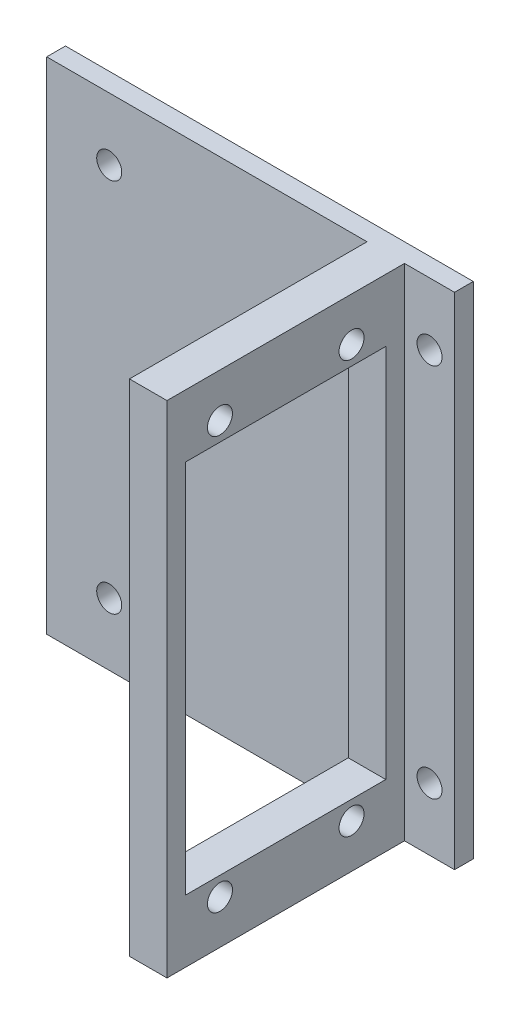
ISO-10303-21;
HEADER;
FILE_DESCRIPTION(('STEP AP214'),'2;1');
FILE_NAME('part.step','',(''),(''),'','','');
FILE_SCHEMA(('AUTOMOTIVE_DESIGN { 1 0 10303 214 1 1 1 1 }'));
ENDSEC;
DATA;
#1=APPLICATION_CONTEXT('core data for automotive mechanical design processes');
#2=APPLICATION_PROTOCOL_DEFINITION('international standard','automotive_design',2000,#1);
#3=PRODUCT_CONTEXT('',#1,'mechanical');
#4=PRODUCT('Part','Part','',(#3));
#5=PRODUCT_RELATED_PRODUCT_CATEGORY('part','',(#4));
#6=PRODUCT_DEFINITION_FORMATION('','',#4);
#7=PRODUCT_DEFINITION_CONTEXT('part definition',#1,'design');
#8=PRODUCT_DEFINITION('design','',#6,#7);
#9=PRODUCT_DEFINITION_SHAPE('','',#8);
#10=(LENGTH_UNIT() NAMED_UNIT(*) SI_UNIT(.MILLI.,.METRE.));
#11=(NAMED_UNIT(*) PLANE_ANGLE_UNIT() SI_UNIT($,.RADIAN.));
#12=(NAMED_UNIT(*) SI_UNIT($,.STERADIAN.) SOLID_ANGLE_UNIT());
#13=UNCERTAINTY_MEASURE_WITH_UNIT(LENGTH_MEASURE(1.E-05),#10,'distance_accuracy_value','');
#14=(GEOMETRIC_REPRESENTATION_CONTEXT(3) GLOBAL_UNCERTAINTY_ASSIGNED_CONTEXT((#13)) GLOBAL_UNIT_ASSIGNED_CONTEXT((#10,
#11,#12)) REPRESENTATION_CONTEXT('',''));
#15=CARTESIAN_POINT('',(0.,0.,0.));
#16=DIRECTION('',(0.,0.,1.));
#17=DIRECTION('',(1.,0.,0.));
#18=AXIS2_PLACEMENT_3D('',#15,#16,#17);
#19=CARTESIAN_POINT('',(0.,0.,3.));
#20=DIRECTION('',(0.,0.,-1.));
#21=DIRECTION('',(-1.,0.,0.));
#22=AXIS2_PLACEMENT_3D('',#19,#20,#21);
#23=PLANE('',#22);
#24=CARTESIAN_POINT('',(-37.99,30.,3.));
#25=DIRECTION('',(0.,0.,1.));
#26=DIRECTION('',(1.,0.,0.));
#27=AXIS2_PLACEMENT_3D('',#24,#25,#26);
#28=CIRCLE('',#27,2.);
#29=CARTESIAN_POINT('',(-35.99,30.,3.));
#30=VERTEX_POINT('',#29);
#31=EDGE_CURVE('E313',#30,#30,#28,.T.);
#32=ORIENTED_EDGE('',*,*,#31,.F.);
#33=EDGE_LOOP('',(#32));
#34=FACE_BOUND('',#33,.T.);
#35=CARTESIAN_POINT('',(-37.99,-30.,3.));
#36=DIRECTION('',(0.,0.,1.));
#37=DIRECTION('',(-1.,0.,0.));
#38=AXIS2_PLACEMENT_3D('',#35,#36,#37);
#39=CIRCLE('',#38,2.);
#40=CARTESIAN_POINT('',(-35.99,-30.,3.));
#41=VERTEX_POINT('',#40);
#42=EDGE_CURVE('E175',#41,#41,#39,.T.);
#43=ORIENTED_EDGE('',*,*,#42,.F.);
#44=EDGE_LOOP('',(#43));
#45=FACE_BOUND('',#44,.T.);
#46=DIRECTION('',(0.,-1.,0.));
#47=VECTOR('',#46,1.);
#48=CARTESIAN_POINT('',(3.24999999999999,40.,3.));
#49=LINE('',#48,#47);
#50=CARTESIAN_POINT('',(3.25,40.,3.));
#51=VERTEX_POINT('',#50);
#52=CARTESIAN_POINT('',(3.25,-40.,3.));
#53=VERTEX_POINT('',#52);
#54=EDGE_CURVE('E229',#51,#53,#49,.T.);
#55=ORIENTED_EDGE('',*,*,#54,.F.);
#56=DIRECTION('',(-1.,0.,0.));
#57=VECTOR('',#56,1.);
#58=CARTESIAN_POINT('',(17.25,40.,3.));
#59=LINE('',#58,#57);
#60=CARTESIAN_POINT('',(-47.99,40.,3.));
#61=VERTEX_POINT('',#60);
#62=EDGE_CURVE('E272',#51,#61,#59,.T.);
#63=ORIENTED_EDGE('',*,*,#62,.T.);
#64=DIRECTION('',(0.,-1.,0.));
#65=VECTOR('',#64,1.);
#66=CARTESIAN_POINT('',(-47.99,40.,3.));
#67=LINE('',#66,#65);
#68=CARTESIAN_POINT('',(-47.99,-40.,3.));
#69=VERTEX_POINT('',#68);
#70=EDGE_CURVE('E162',#61,#69,#67,.T.);
#71=ORIENTED_EDGE('',*,*,#70,.T.);
#72=DIRECTION('',(1.,0.,0.));
#73=VECTOR('',#72,1.);
#74=CARTESIAN_POINT('',(17.25,-40.,3.));
#75=LINE('',#74,#73);
#76=EDGE_CURVE('E266',#69,#53,#75,.T.);
#77=ORIENTED_EDGE('',*,*,#76,.T.);
#78=EDGE_LOOP('',(#55,#63,#71,#77));
#79=FACE_BOUND('',#78,.T.);
#80=ADVANCED_FACE('F47',(#34,#45,#79),#23,.F.);
#81=CARTESIAN_POINT('',(13.25,30.,3.));
#82=DIRECTION('',(0.,0.,1.));
#83=DIRECTION('',(1.,0.,0.));
#84=AXIS2_PLACEMENT_3D('',#81,#82,#83);
#85=CIRCLE('',#84,2.);
#86=CARTESIAN_POINT('',(15.25,30.,2.99999999999998));
#87=VERTEX_POINT('',#86);
#88=EDGE_CURVE('E317',#87,#87,#85,.T.);
#89=ORIENTED_EDGE('',*,*,#88,.F.);
#90=EDGE_LOOP('',(#89));
#91=FACE_BOUND('',#90,.T.);
#92=CARTESIAN_POINT('',(13.25,-30.,3.));
#93=DIRECTION('',(0.,0.,1.));
#94=DIRECTION('',(1.,0.,0.));
#95=AXIS2_PLACEMENT_3D('',#92,#93,#94);
#96=CIRCLE('',#95,2.);
#97=CARTESIAN_POINT('',(15.25,-30.,2.99999999999998));
#98=VERTEX_POINT('',#97);
#99=EDGE_CURVE('E324',#98,#98,#96,.T.);
#100=ORIENTED_EDGE('',*,*,#99,.F.);
#101=EDGE_LOOP('',(#100));
#102=FACE_BOUND('',#101,.T.);
#103=DIRECTION('',(0.,1.,0.));
#104=VECTOR('',#103,1.);
#105=CARTESIAN_POINT('',(9.24999999999999,40.,3.));
#106=LINE('',#105,#104);
#107=CARTESIAN_POINT('',(9.25,-40.,3.));
#108=VERTEX_POINT('',#107);
#109=CARTESIAN_POINT('',(9.24999999999999,40.,3.));
#110=VERTEX_POINT('',#109);
#111=EDGE_CURVE('E235',#108,#110,#106,.T.);
#112=ORIENTED_EDGE('',*,*,#111,.F.);
#113=CARTESIAN_POINT('',(17.25,-40.,3.));
#114=VERTEX_POINT('',#113);
#115=EDGE_CURVE('E151',#108,#114,#75,.T.);
#116=ORIENTED_EDGE('',*,*,#115,.T.);
#117=DIRECTION('',(0.,1.,0.));
#118=VECTOR('',#117,1.);
#119=CARTESIAN_POINT('',(17.25,40.,3.));
#120=LINE('',#119,#118);
#121=CARTESIAN_POINT('',(17.25,40.,3.));
#122=VERTEX_POINT('',#121);
#123=EDGE_CURVE('E269',#114,#122,#120,.T.);
#124=ORIENTED_EDGE('',*,*,#123,.T.);
#125=EDGE_CURVE('E273',#122,#110,#59,.T.);
#126=ORIENTED_EDGE('',*,*,#125,.T.);
#127=EDGE_LOOP('',(#112,#116,#124,#126));
#128=FACE_BOUND('',#127,.T.);
#129=ADVANCED_FACE('F343',(#91,#102,#128),#23,.F.);
#130=CARTESIAN_POINT('',(17.25,-40.,3.));
#131=DIRECTION('',(0.,1.,0.));
#132=DIRECTION('',(-1.,0.,0.));
#133=AXIS2_PLACEMENT_3D('',#130,#131,#132);
#134=PLANE('',#133);
#135=DIRECTION('',(1.,0.,0.));
#136=VECTOR('',#135,1.);
#137=CARTESIAN_POINT('',(17.25,-40.,0.));
#138=LINE('',#137,#136);
#139=CARTESIAN_POINT('',(-47.99,-40.,0.));
#140=VERTEX_POINT('',#139);
#141=CARTESIAN_POINT('',(17.25,-40.,0.));
#142=VERTEX_POINT('',#141);
#143=EDGE_CURVE('E166',#140,#142,#138,.T.);
#144=ORIENTED_EDGE('',*,*,#143,.T.);
#145=DIRECTION('',(0.,0.,-1.));
#146=VECTOR('',#145,1.);
#147=CARTESIAN_POINT('',(17.25,-40.,3.));
#148=LINE('',#147,#146);
#149=EDGE_CURVE('E282',#114,#142,#148,.T.);
#150=ORIENTED_EDGE('',*,*,#149,.F.);
#151=ORIENTED_EDGE('',*,*,#115,.F.);
#152=DIRECTION('',(0.,0.,-1.));
#153=VECTOR('',#152,1.);
#154=CARTESIAN_POINT('',(9.25,-40.,41.));
#155=LINE('',#154,#153);
#156=CARTESIAN_POINT('',(9.25,-40.,41.));
#157=VERTEX_POINT('',#156);
#158=EDGE_CURVE('E258',#157,#108,#155,.T.);
#159=ORIENTED_EDGE('',*,*,#158,.F.);
#160=DIRECTION('',(1.,0.,0.));
#161=VECTOR('',#160,1.);
#162=CARTESIAN_POINT('',(3.25,-40.,41.));
#163=LINE('',#162,#161);
#164=CARTESIAN_POINT('',(3.25,-40.,41.));
#165=VERTEX_POINT('',#164);
#166=EDGE_CURVE('E234',#165,#157,#163,.T.);
#167=ORIENTED_EDGE('',*,*,#166,.F.);
#168=DIRECTION('',(0.,0.,-1.));
#169=VECTOR('',#168,1.);
#170=CARTESIAN_POINT('',(3.25,-40.,41.));
#171=LINE('',#170,#169);
#172=EDGE_CURVE('E262',#165,#53,#171,.T.);
#173=ORIENTED_EDGE('',*,*,#172,.T.);
#174=ORIENTED_EDGE('',*,*,#76,.F.);
#175=DIRECTION('',(0.,0.,-1.));
#176=VECTOR('',#175,1.);
#177=CARTESIAN_POINT('',(-47.99,-40.,0.));
#178=LINE('',#177,#176);
#179=EDGE_CURVE('E180',#69,#140,#178,.T.);
#180=ORIENTED_EDGE('',*,*,#179,.T.);
#181=EDGE_LOOP('',(#144,#150,#151,#159,#167,#173,#174,#180));
#182=FACE_BOUND('',#181,.T.);
#183=ADVANCED_FACE('F49',(#182),#134,.F.);
#184=CARTESIAN_POINT('',(17.25,40.,3.));
#185=DIRECTION('',(-1.,0.,0.));
#186=DIRECTION('',(0.,-1.,0.));
#187=AXIS2_PLACEMENT_3D('',#184,#185,#186);
#188=PLANE('',#187);
#189=DIRECTION('',(0.,1.,0.));
#190=VECTOR('',#189,1.);
#191=CARTESIAN_POINT('',(17.25,40.,0.));
#192=LINE('',#191,#190);
#193=CARTESIAN_POINT('',(17.25,40.,0.));
#194=VERTEX_POINT('',#193);
#195=EDGE_CURVE('E152',#142,#194,#192,.T.);
#196=ORIENTED_EDGE('',*,*,#195,.T.);
#197=DIRECTION('',(0.,0.,-1.));
#198=VECTOR('',#197,1.);
#199=CARTESIAN_POINT('',(17.25,40.,3.));
#200=LINE('',#199,#198);
#201=EDGE_CURVE('E146',#122,#194,#200,.T.);
#202=ORIENTED_EDGE('',*,*,#201,.F.);
#203=ORIENTED_EDGE('',*,*,#123,.F.);
#204=ORIENTED_EDGE('',*,*,#149,.T.);
#205=EDGE_LOOP('',(#196,#202,#203,#204));
#206=FACE_BOUND('',#205,.T.);
#207=ADVANCED_FACE('F367',(#206),#188,.F.);
#208=CARTESIAN_POINT('',(17.25,40.,3.));
#209=DIRECTION('',(0.,-1.,0.));
#210=DIRECTION('',(0.,0.,-1.));
#211=AXIS2_PLACEMENT_3D('',#208,#209,#210);
#212=PLANE('',#211);
#213=DIRECTION('',(-1.,0.,0.));
#214=VECTOR('',#213,1.);
#215=CARTESIAN_POINT('',(17.25,40.,0.));
#216=LINE('',#215,#214);
#217=CARTESIAN_POINT('',(-47.99,40.,0.));
#218=VERTEX_POINT('',#217);
#219=EDGE_CURVE('E139',#194,#218,#216,.T.);
#220=ORIENTED_EDGE('',*,*,#219,.T.);
#221=DIRECTION('',(0.,0.,1.));
#222=VECTOR('',#221,1.);
#223=CARTESIAN_POINT('',(-47.99,40.,0.));
#224=LINE('',#223,#222);
#225=EDGE_CURVE('E143',#218,#61,#224,.T.);
#226=ORIENTED_EDGE('',*,*,#225,.T.);
#227=ORIENTED_EDGE('',*,*,#62,.F.);
#228=DIRECTION('',(0.,0.,-1.));
#229=VECTOR('',#228,1.);
#230=CARTESIAN_POINT('',(3.24999999999999,40.,41.));
#231=LINE('',#230,#229);
#232=CARTESIAN_POINT('',(3.24999999999999,40.,41.));
#233=VERTEX_POINT('',#232);
#234=EDGE_CURVE('E244',#233,#51,#231,.T.);
#235=ORIENTED_EDGE('',*,*,#234,.F.);
#236=DIRECTION('',(-1.,0.,0.));
#237=VECTOR('',#236,1.);
#238=CARTESIAN_POINT('',(3.24999999999999,40.,41.));
#239=LINE('',#238,#237);
#240=CARTESIAN_POINT('',(9.24999999999999,40.,41.));
#241=VERTEX_POINT('',#240);
#242=EDGE_CURVE('E241',#241,#233,#239,.T.);
#243=ORIENTED_EDGE('',*,*,#242,.F.);
#244=DIRECTION('',(0.,0.,-1.));
#245=VECTOR('',#244,1.);
#246=CARTESIAN_POINT('',(9.24999999999999,40.,41.));
#247=LINE('',#246,#245);
#248=EDGE_CURVE('E254',#241,#110,#247,.T.);
#249=ORIENTED_EDGE('',*,*,#248,.T.);
#250=ORIENTED_EDGE('',*,*,#125,.F.);
#251=ORIENTED_EDGE('',*,*,#201,.T.);
#252=EDGE_LOOP('',(#220,#226,#227,#235,#243,#249,#250,#251));
#253=FACE_BOUND('',#252,.T.);
#254=ADVANCED_FACE('F141',(#253),#212,.F.);
#255=CARTESIAN_POINT('',(0.,0.,0.));
#256=DIRECTION('',(0.,0.,-1.));
#257=DIRECTION('',(-1.,0.,0.));
#258=AXIS2_PLACEMENT_3D('',#255,#256,#257);
#259=PLANE('',#258);
#260=CARTESIAN_POINT('',(13.25,30.,0.));
#261=DIRECTION('',(0.,0.,-1.));
#262=DIRECTION('',(-1.,0.,0.));
#263=AXIS2_PLACEMENT_3D('',#260,#261,#262);
#264=CIRCLE('',#263,2.);
#265=CARTESIAN_POINT('',(15.25,30.,0.));
#266=VERTEX_POINT('',#265);
#267=EDGE_CURVE('E51',#266,#266,#264,.T.);
#268=ORIENTED_EDGE('',*,*,#267,.F.);
#269=EDGE_LOOP('',(#268));
#270=FACE_BOUND('',#269,.T.);
#271=CARTESIAN_POINT('',(13.25,-30.,0.));
#272=DIRECTION('',(0.,0.,-1.));
#273=DIRECTION('',(-1.,0.,0.));
#274=AXIS2_PLACEMENT_3D('',#271,#272,#273);
#275=CIRCLE('',#274,2.);
#276=CARTESIAN_POINT('',(15.25,-30.,0.));
#277=VERTEX_POINT('',#276);
#278=EDGE_CURVE('E314',#277,#277,#275,.T.);
#279=ORIENTED_EDGE('',*,*,#278,.F.);
#280=EDGE_LOOP('',(#279));
#281=FACE_BOUND('',#280,.T.);
#282=CARTESIAN_POINT('',(-37.99,30.,0.));
#283=DIRECTION('',(0.,0.,-1.));
#284=DIRECTION('',(-1.,0.,0.));
#285=AXIS2_PLACEMENT_3D('',#282,#283,#284);
#286=CIRCLE('',#285,2.);
#287=CARTESIAN_POINT('',(-35.99,30.,0.));
#288=VERTEX_POINT('',#287);
#289=EDGE_CURVE('E168',#288,#288,#286,.T.);
#290=ORIENTED_EDGE('',*,*,#289,.F.);
#291=EDGE_LOOP('',(#290));
#292=FACE_BOUND('',#291,.T.);
#293=CARTESIAN_POINT('',(-37.99,-30.,0.));
#294=DIRECTION('',(0.,0.,-1.));
#295=DIRECTION('',(-1.,0.,0.));
#296=AXIS2_PLACEMENT_3D('',#293,#294,#295);
#297=CIRCLE('',#296,2.);
#298=CARTESIAN_POINT('',(-35.99,-30.,0.));
#299=VERTEX_POINT('',#298);
#300=EDGE_CURVE('E172',#299,#299,#297,.T.);
#301=ORIENTED_EDGE('',*,*,#300,.F.);
#302=EDGE_LOOP('',(#301));
#303=FACE_BOUND('',#302,.T.);
#304=ORIENTED_EDGE('',*,*,#143,.F.);
#305=DIRECTION('',(0.,1.,0.));
#306=VECTOR('',#305,1.);
#307=CARTESIAN_POINT('',(-47.99,40.,0.));
#308=LINE('',#307,#306);
#309=EDGE_CURVE('E159',#140,#218,#308,.T.);
#310=ORIENTED_EDGE('',*,*,#309,.T.);
#311=ORIENTED_EDGE('',*,*,#219,.F.);
#312=ORIENTED_EDGE('',*,*,#195,.F.);
#313=EDGE_LOOP('',(#304,#310,#311,#312));
#314=FACE_BOUND('',#313,.T.);
#315=ADVANCED_FACE('F165',(#270,#281,#292,#303,#314),#259,.T.);
#316=CARTESIAN_POINT('',(3.24999999999999,40.,41.));
#317=DIRECTION('',(1.,0.,0.));
#318=DIRECTION('',(0.,1.,0.));
#319=AXIS2_PLACEMENT_3D('',#316,#317,#318);
#320=PLANE('',#319);
#321=CARTESIAN_POINT('',(3.25,-33.,11.475));
#322=DIRECTION('',(-1.,0.,0.));
#323=DIRECTION('',(0.,0.,-1.));
#324=AXIS2_PLACEMENT_3D('',#321,#322,#323);
#325=CIRCLE('',#324,2.);
#326=CARTESIAN_POINT('',(3.25,-33.,9.475));
#327=VERTEX_POINT('',#326);
#328=EDGE_CURVE('E183',#327,#327,#325,.T.);
#329=ORIENTED_EDGE('',*,*,#328,.F.);
#330=EDGE_LOOP('',(#329));
#331=FACE_BOUND('',#330,.T.);
#332=CARTESIAN_POINT('',(3.25,-33.,32.525));
#333=DIRECTION('',(-1.,0.,0.));
#334=DIRECTION('',(0.,0.,-1.));
#335=AXIS2_PLACEMENT_3D('',#332,#333,#334);
#336=CIRCLE('',#335,2.);
#337=CARTESIAN_POINT('',(3.25,-33.,30.525));
#338=VERTEX_POINT('',#337);
#339=EDGE_CURVE('E189',#338,#338,#336,.T.);
#340=ORIENTED_EDGE('',*,*,#339,.F.);
#341=EDGE_LOOP('',(#340));
#342=FACE_BOUND('',#341,.T.);
#343=CARTESIAN_POINT('',(3.25,33.,32.525));
#344=DIRECTION('',(-1.,0.,0.));
#345=DIRECTION('',(0.,0.,1.));
#346=AXIS2_PLACEMENT_3D('',#343,#344,#345);
#347=CIRCLE('',#346,2.);
#348=CARTESIAN_POINT('',(3.25,33.,34.525));
#349=VERTEX_POINT('',#348);
#350=EDGE_CURVE('E184',#349,#349,#347,.T.);
#351=ORIENTED_EDGE('',*,*,#350,.F.);
#352=EDGE_LOOP('',(#351));
#353=FACE_BOUND('',#352,.T.);
#354=CARTESIAN_POINT('',(3.25,33.,11.475));
#355=DIRECTION('',(-1.,0.,0.));
#356=DIRECTION('',(0.,0.,1.));
#357=AXIS2_PLACEMENT_3D('',#354,#355,#356);
#358=CIRCLE('',#357,2.);
#359=CARTESIAN_POINT('',(3.25,33.,13.475));
#360=VERTEX_POINT('',#359);
#361=EDGE_CURVE('E188',#360,#360,#358,.T.);
#362=ORIENTED_EDGE('',*,*,#361,.F.);
#363=EDGE_LOOP('',(#362));
#364=FACE_BOUND('',#363,.T.);
#365=DIRECTION('',(0.,0.,1.));
#366=VECTOR('',#365,1.);
#367=CARTESIAN_POINT('',(3.24999999999999,30.,41.));
#368=LINE('',#367,#366);
#369=CARTESIAN_POINT('',(3.25,30.,6.));
#370=VERTEX_POINT('',#369);
#371=CARTESIAN_POINT('',(3.24999999999999,30.,38.));
#372=VERTEX_POINT('',#371);
#373=EDGE_CURVE('E221',#370,#372,#368,.T.);
#374=ORIENTED_EDGE('',*,*,#373,.T.);
#375=DIRECTION('',(0.,-1.,0.));
#376=VECTOR('',#375,1.);
#377=CARTESIAN_POINT('',(3.24999999999999,40.,38.));
#378=LINE('',#377,#376);
#379=CARTESIAN_POINT('',(3.25,-30.,38.));
#380=VERTEX_POINT('',#379);
#381=EDGE_CURVE('E225',#372,#380,#378,.T.);
#382=ORIENTED_EDGE('',*,*,#381,.T.);
#383=DIRECTION('',(0.,0.,-1.));
#384=VECTOR('',#383,1.);
#385=CARTESIAN_POINT('',(3.25,-30.,41.));
#386=LINE('',#385,#384);
#387=CARTESIAN_POINT('',(3.25,-30.,6.00000000000001));
#388=VERTEX_POINT('',#387);
#389=EDGE_CURVE('E204',#380,#388,#386,.T.);
#390=ORIENTED_EDGE('',*,*,#389,.T.);
#391=DIRECTION('',(0.,1.,0.));
#392=VECTOR('',#391,1.);
#393=CARTESIAN_POINT('',(3.24999999999999,40.,6.));
#394=LINE('',#393,#392);
#395=EDGE_CURVE('E217',#388,#370,#394,.T.);
#396=ORIENTED_EDGE('',*,*,#395,.T.);
#397=EDGE_LOOP('',(#374,#382,#390,#396));
#398=FACE_BOUND('',#397,.T.);
#399=ORIENTED_EDGE('',*,*,#54,.T.);
#400=ORIENTED_EDGE('',*,*,#172,.F.);
#401=DIRECTION('',(0.,-1.,0.));
#402=VECTOR('',#401,1.);
#403=CARTESIAN_POINT('',(3.24999999999999,40.,41.));
#404=LINE('',#403,#402);
#405=EDGE_CURVE('E230',#233,#165,#404,.T.);
#406=ORIENTED_EDGE('',*,*,#405,.F.);
#407=ORIENTED_EDGE('',*,*,#234,.T.);
#408=EDGE_LOOP('',(#399,#400,#406,#407));
#409=FACE_BOUND('',#408,.T.);
#410=ADVANCED_FACE('F352',(#331,#342,#353,#364,#398,#409),#320,.F.);
#411=CARTESIAN_POINT('',(9.24999999999999,40.,41.));
#412=DIRECTION('',(-1.,0.,0.));
#413=DIRECTION('',(0.,-1.,0.));
#414=AXIS2_PLACEMENT_3D('',#411,#412,#413);
#415=PLANE('',#414);
#416=CARTESIAN_POINT('',(9.25,-33.,11.475));
#417=DIRECTION('',(-1.,0.,0.));
#418=DIRECTION('',(0.,-1.,0.));
#419=AXIS2_PLACEMENT_3D('',#416,#417,#418);
#420=CIRCLE('',#419,2.);
#421=CARTESIAN_POINT('',(9.25,-35.,11.475));
#422=VERTEX_POINT('',#421);
#423=EDGE_CURVE('E213',#422,#422,#420,.T.);
#424=ORIENTED_EDGE('',*,*,#423,.T.);
#425=EDGE_LOOP('',(#424));
#426=FACE_BOUND('',#425,.T.);
#427=CARTESIAN_POINT('',(9.25,-33.,32.525));
#428=DIRECTION('',(-1.,0.,0.));
#429=DIRECTION('',(0.,-1.,0.));
#430=AXIS2_PLACEMENT_3D('',#427,#428,#429);
#431=CIRCLE('',#430,2.);
#432=CARTESIAN_POINT('',(9.25,-35.,32.525));
#433=VERTEX_POINT('',#432);
#434=EDGE_CURVE('E304',#433,#433,#431,.T.);
#435=ORIENTED_EDGE('',*,*,#434,.T.);
#436=EDGE_LOOP('',(#435));
#437=FACE_BOUND('',#436,.T.);
#438=CARTESIAN_POINT('',(9.24999999999999,33.,32.525));
#439=DIRECTION('',(-1.,0.,0.));
#440=DIRECTION('',(0.,-1.,0.));
#441=AXIS2_PLACEMENT_3D('',#438,#439,#440);
#442=CIRCLE('',#441,2.);
#443=CARTESIAN_POINT('',(9.24999999999999,31.,32.525));
#444=VERTEX_POINT('',#443);
#445=EDGE_CURVE('E300',#444,#444,#442,.T.);
#446=ORIENTED_EDGE('',*,*,#445,.T.);
#447=EDGE_LOOP('',(#446));
#448=FACE_BOUND('',#447,.T.);
#449=CARTESIAN_POINT('',(9.24999999999999,33.,11.475));
#450=DIRECTION('',(-1.,0.,0.));
#451=DIRECTION('',(0.,-1.,0.));
#452=AXIS2_PLACEMENT_3D('',#449,#450,#451);
#453=CIRCLE('',#452,2.);
#454=CARTESIAN_POINT('',(9.24999999999999,31.,11.475));
#455=VERTEX_POINT('',#454);
#456=EDGE_CURVE('E199',#455,#455,#453,.T.);
#457=ORIENTED_EDGE('',*,*,#456,.T.);
#458=EDGE_LOOP('',(#457));
#459=FACE_BOUND('',#458,.T.);
#460=DIRECTION('',(0.,0.,1.));
#461=VECTOR('',#460,1.);
#462=CARTESIAN_POINT('',(9.25,-30.,41.));
#463=LINE('',#462,#461);
#464=CARTESIAN_POINT('',(9.25,-30.,6.));
#465=VERTEX_POINT('',#464);
#466=CARTESIAN_POINT('',(9.25,-30.,38.));
#467=VERTEX_POINT('',#466);
#468=EDGE_CURVE('E286',#465,#467,#463,.T.);
#469=ORIENTED_EDGE('',*,*,#468,.T.);
#470=DIRECTION('',(0.,1.,0.));
#471=VECTOR('',#470,1.);
#472=CARTESIAN_POINT('',(9.24999999999999,40.,38.));
#473=LINE('',#472,#471);
#474=CARTESIAN_POINT('',(9.24999999999999,30.,38.));
#475=VERTEX_POINT('',#474);
#476=EDGE_CURVE('E11',#467,#475,#473,.T.);
#477=ORIENTED_EDGE('',*,*,#476,.T.);
#478=DIRECTION('',(0.,0.,-1.));
#479=VECTOR('',#478,1.);
#480=CARTESIAN_POINT('',(9.24999999999999,30.,41.));
#481=LINE('',#480,#479);
#482=CARTESIAN_POINT('',(9.24999999999999,30.,6.));
#483=VERTEX_POINT('',#482);
#484=EDGE_CURVE('E57',#475,#483,#481,.T.);
#485=ORIENTED_EDGE('',*,*,#484,.T.);
#486=DIRECTION('',(0.,-1.,0.));
#487=VECTOR('',#486,1.);
#488=CARTESIAN_POINT('',(9.24999999999999,40.,6.));
#489=LINE('',#488,#487);
#490=EDGE_CURVE('E290',#483,#465,#489,.T.);
#491=ORIENTED_EDGE('',*,*,#490,.T.);
#492=EDGE_LOOP('',(#469,#477,#485,#491));
#493=FACE_BOUND('',#492,.T.);
#494=ORIENTED_EDGE('',*,*,#111,.T.);
#495=ORIENTED_EDGE('',*,*,#248,.F.);
#496=DIRECTION('',(0.,1.,0.));
#497=VECTOR('',#496,1.);
#498=CARTESIAN_POINT('',(9.24999999999999,40.,41.));
#499=LINE('',#498,#497);
#500=EDGE_CURVE('E238',#157,#241,#499,.T.);
#501=ORIENTED_EDGE('',*,*,#500,.F.);
#502=ORIENTED_EDGE('',*,*,#158,.T.);
#503=EDGE_LOOP('',(#494,#495,#501,#502));
#504=FACE_BOUND('',#503,.T.);
#505=ADVANCED_FACE('F359',(#426,#437,#448,#459,#493,#504),#415,.F.);
#506=CARTESIAN_POINT('',(0.,0.,41.));
#507=DIRECTION('',(0.,0.,1.));
#508=DIRECTION('',(1.,0.,0.));
#509=AXIS2_PLACEMENT_3D('',#506,#507,#508);
#510=PLANE('',#509);
#511=ORIENTED_EDGE('',*,*,#405,.T.);
#512=ORIENTED_EDGE('',*,*,#166,.T.);
#513=ORIENTED_EDGE('',*,*,#500,.T.);
#514=ORIENTED_EDGE('',*,*,#242,.T.);
#515=EDGE_LOOP('',(#511,#512,#513,#514));
#516=FACE_BOUND('',#515,.T.);
#517=ADVANCED_FACE('F354',(#516),#510,.T.);
#518=CARTESIAN_POINT('',(-17.25,30.,38.));
#519=DIRECTION('',(0.,0.,1.));
#520=DIRECTION('',(1.,0.,0.));
#521=AXIS2_PLACEMENT_3D('',#518,#519,#520);
#522=PLANE('',#521);
#523=DIRECTION('',(1.,0.,0.));
#524=VECTOR('',#523,1.);
#525=CARTESIAN_POINT('',(-17.25,30.,38.));
#526=LINE('',#525,#524);
#527=EDGE_CURVE('E200',#372,#475,#526,.T.);
#528=ORIENTED_EDGE('',*,*,#527,.T.);
#529=ORIENTED_EDGE('',*,*,#476,.F.);
#530=DIRECTION('',(1.,0.,0.));
#531=VECTOR('',#530,1.);
#532=CARTESIAN_POINT('',(-17.25,-30.,38.));
#533=LINE('',#532,#531);
#534=EDGE_CURVE('E70',#380,#467,#533,.T.);
#535=ORIENTED_EDGE('',*,*,#534,.F.);
#536=ORIENTED_EDGE('',*,*,#381,.F.);
#537=EDGE_LOOP('',(#528,#529,#535,#536));
#538=FACE_BOUND('',#537,.T.);
#539=ADVANCED_FACE('F386',(#538),#522,.F.);
#540=CARTESIAN_POINT('',(-17.25,30.,6.));
#541=DIRECTION('',(0.,1.,0.));
#542=DIRECTION('',(-1.,0.,0.));
#543=AXIS2_PLACEMENT_3D('',#540,#541,#542);
#544=PLANE('',#543);
#545=DIRECTION('',(1.,0.,0.));
#546=VECTOR('',#545,1.);
#547=CARTESIAN_POINT('',(-17.25,30.,6.));
#548=LINE('',#547,#546);
#549=EDGE_CURVE('E205',#370,#483,#548,.T.);
#550=ORIENTED_EDGE('',*,*,#549,.T.);
#551=ORIENTED_EDGE('',*,*,#484,.F.);
#552=ORIENTED_EDGE('',*,*,#527,.F.);
#553=ORIENTED_EDGE('',*,*,#373,.F.);
#554=EDGE_LOOP('',(#550,#551,#552,#553));
#555=FACE_BOUND('',#554,.T.);
#556=ADVANCED_FACE('F389',(#555),#544,.F.);
#557=CARTESIAN_POINT('',(-17.25,30.,6.));
#558=DIRECTION('',(0.,0.,-1.));
#559=DIRECTION('',(-1.,0.,0.));
#560=AXIS2_PLACEMENT_3D('',#557,#558,#559);
#561=PLANE('',#560);
#562=DIRECTION('',(1.,0.,0.));
#563=VECTOR('',#562,1.);
#564=CARTESIAN_POINT('',(-17.25,-30.,6.));
#565=LINE('',#564,#563);
#566=EDGE_CURVE('E65',#388,#465,#565,.T.);
#567=ORIENTED_EDGE('',*,*,#566,.T.);
#568=ORIENTED_EDGE('',*,*,#490,.F.);
#569=ORIENTED_EDGE('',*,*,#549,.F.);
#570=ORIENTED_EDGE('',*,*,#395,.F.);
#571=EDGE_LOOP('',(#567,#568,#569,#570));
#572=FACE_BOUND('',#571,.T.);
#573=ADVANCED_FACE('F395',(#572),#561,.F.);
#574=CARTESIAN_POINT('',(-17.25,-30.,6.));
#575=DIRECTION('',(0.,-1.,0.));
#576=DIRECTION('',(1.,0.,0.));
#577=AXIS2_PLACEMENT_3D('',#574,#575,#576);
#578=PLANE('',#577);
#579=ORIENTED_EDGE('',*,*,#534,.T.);
#580=ORIENTED_EDGE('',*,*,#468,.F.);
#581=ORIENTED_EDGE('',*,*,#566,.F.);
#582=ORIENTED_EDGE('',*,*,#389,.F.);
#583=EDGE_LOOP('',(#579,#580,#581,#582));
#584=FACE_BOUND('',#583,.T.);
#585=ADVANCED_FACE('F391',(#584),#578,.F.);
#586=CARTESIAN_POINT('',(17.25,33.,11.475));
#587=DIRECTION('',(-1.,0.,0.));
#588=DIRECTION('',(0.,0.,1.));
#589=AXIS2_PLACEMENT_3D('',#586,#587,#588);
#590=CYLINDRICAL_SURFACE('',#589,2.);
#591=ORIENTED_EDGE('',*,*,#361,.T.);
#592=EDGE_LOOP('',(#591));
#593=FACE_BOUND('',#592,.T.);
#594=ORIENTED_EDGE('',*,*,#456,.F.);
#595=EDGE_LOOP('',(#594));
#596=FACE_BOUND('',#595,.T.);
#597=ADVANCED_FACE('F394',(#593,#596),#590,.F.);
#598=CARTESIAN_POINT('',(17.25,33.,32.525));
#599=DIRECTION('',(-1.,0.,0.));
#600=DIRECTION('',(0.,0.,1.));
#601=AXIS2_PLACEMENT_3D('',#598,#599,#600);
#602=CYLINDRICAL_SURFACE('',#601,2.);
#603=ORIENTED_EDGE('',*,*,#350,.T.);
#604=EDGE_LOOP('',(#603));
#605=FACE_BOUND('',#604,.T.);
#606=ORIENTED_EDGE('',*,*,#445,.F.);
#607=EDGE_LOOP('',(#606));
#608=FACE_BOUND('',#607,.T.);
#609=ADVANCED_FACE('F404',(#605,#608),#602,.F.);
#610=CARTESIAN_POINT('',(17.25,-33.,32.525));
#611=DIRECTION('',(-1.,0.,0.));
#612=DIRECTION('',(0.,0.,1.));
#613=AXIS2_PLACEMENT_3D('',#610,#611,#612);
#614=CYLINDRICAL_SURFACE('',#613,2.);
#615=ORIENTED_EDGE('',*,*,#339,.T.);
#616=EDGE_LOOP('',(#615));
#617=FACE_BOUND('',#616,.T.);
#618=ORIENTED_EDGE('',*,*,#434,.F.);
#619=EDGE_LOOP('',(#618));
#620=FACE_BOUND('',#619,.T.);
#621=ADVANCED_FACE('F409',(#617,#620),#614,.F.);
#622=CARTESIAN_POINT('',(17.25,-33.,11.475));
#623=DIRECTION('',(-1.,0.,0.));
#624=DIRECTION('',(0.,0.,1.));
#625=AXIS2_PLACEMENT_3D('',#622,#623,#624);
#626=CYLINDRICAL_SURFACE('',#625,2.);
#627=ORIENTED_EDGE('',*,*,#328,.T.);
#628=EDGE_LOOP('',(#627));
#629=FACE_BOUND('',#628,.T.);
#630=ORIENTED_EDGE('',*,*,#423,.F.);
#631=EDGE_LOOP('',(#630));
#632=FACE_BOUND('',#631,.T.);
#633=ADVANCED_FACE('F406',(#629,#632),#626,.F.);
#634=CARTESIAN_POINT('',(-47.99,0.,0.));
#635=DIRECTION('',(-1.,0.,0.));
#636=DIRECTION('',(0.,-1.,0.));
#637=AXIS2_PLACEMENT_3D('',#634,#635,#636);
#638=PLANE('',#637);
#639=ORIENTED_EDGE('',*,*,#309,.F.);
#640=ORIENTED_EDGE('',*,*,#179,.F.);
#641=ORIENTED_EDGE('',*,*,#70,.F.);
#642=ORIENTED_EDGE('',*,*,#225,.F.);
#643=EDGE_LOOP('',(#639,#640,#641,#642));
#644=FACE_BOUND('',#643,.T.);
#645=ADVANCED_FACE('F157',(#644),#638,.T.);
#646=CARTESIAN_POINT('',(-37.99,-30.,-27.74));
#647=DIRECTION('',(0.,0.,1.));
#648=DIRECTION('',(1.,0.,0.));
#649=AXIS2_PLACEMENT_3D('',#646,#647,#648);
#650=CYLINDRICAL_SURFACE('',#649,2.);
#651=CARTESIAN_POINT('',(-35.99,-30.,0.));
#652=CARTESIAN_POINT('',(-35.99,-30.,0.0312500000000035));
#653=CARTESIAN_POINT('',(-35.99,-30.,0.0625000000000035));
#654=CARTESIAN_POINT('',(-35.99,-30.,0.125000000000004));
#655=CARTESIAN_POINT('',(-35.99,-30.,0.156250000000004));
#656=CARTESIAN_POINT('',(-35.99,-30.,0.218750000000004));
#657=CARTESIAN_POINT('',(-35.99,-30.,0.250000000000004));
#658=CARTESIAN_POINT('',(-35.99,-30.,0.312500000000004));
#659=CARTESIAN_POINT('',(-35.99,-30.,0.343750000000004));
#660=CARTESIAN_POINT('',(-35.99,-30.,0.406250000000004));
#661=CARTESIAN_POINT('',(-35.99,-30.,0.437500000000004));
#662=CARTESIAN_POINT('',(-35.99,-30.,0.500000000000004));
#663=CARTESIAN_POINT('',(-35.99,-30.,0.531250000000004));
#664=CARTESIAN_POINT('',(-35.99,-30.,0.593750000000004));
#665=CARTESIAN_POINT('',(-35.99,-30.,0.625000000000004));
#666=CARTESIAN_POINT('',(-35.99,-30.,0.687500000000004));
#667=CARTESIAN_POINT('',(-35.99,-30.,0.718750000000004));
#668=CARTESIAN_POINT('',(-35.99,-30.,0.781250000000003));
#669=CARTESIAN_POINT('',(-35.99,-30.,0.812500000000002));
#670=CARTESIAN_POINT('',(-35.99,-30.,0.875000000000001));
#671=CARTESIAN_POINT('',(-35.99,-30.,0.906250000000001));
#672=CARTESIAN_POINT('',(-35.99,-30.,0.968750000000001));
#673=CARTESIAN_POINT('',(-35.99,-30.,1.));
#674=CARTESIAN_POINT('',(-35.99,-30.,1.0625));
#675=CARTESIAN_POINT('',(-35.99,-30.,1.09375));
#676=CARTESIAN_POINT('',(-35.99,-30.,1.15625));
#677=CARTESIAN_POINT('',(-35.99,-30.,1.1875));
#678=CARTESIAN_POINT('',(-35.99,-30.,1.25));
#679=CARTESIAN_POINT('',(-35.99,-30.,1.28125));
#680=CARTESIAN_POINT('',(-35.99,-30.,1.34375));
#681=CARTESIAN_POINT('',(-35.99,-30.,1.375));
#682=CARTESIAN_POINT('',(-35.99,-30.,1.4375));
#683=CARTESIAN_POINT('',(-35.99,-30.,1.46875));
#684=CARTESIAN_POINT('',(-35.99,-30.,1.53125));
#685=CARTESIAN_POINT('',(-35.99,-30.,1.5625));
#686=CARTESIAN_POINT('',(-35.99,-30.,1.625));
#687=CARTESIAN_POINT('',(-35.99,-30.,1.65625));
#688=CARTESIAN_POINT('',(-35.99,-30.,1.71875));
#689=CARTESIAN_POINT('',(-35.99,-30.,1.75));
#690=CARTESIAN_POINT('',(-35.99,-30.,1.8125));
#691=CARTESIAN_POINT('',(-35.99,-30.,1.84375));
#692=CARTESIAN_POINT('',(-35.99,-30.,1.90625));
#693=CARTESIAN_POINT('',(-35.99,-30.,1.9375));
#694=CARTESIAN_POINT('',(-35.99,-30.,2.));
#695=CARTESIAN_POINT('',(-35.99,-30.,2.03125));
#696=CARTESIAN_POINT('',(-35.99,-30.,2.09375));
#697=CARTESIAN_POINT('',(-35.99,-30.,2.125));
#698=CARTESIAN_POINT('',(-35.99,-30.,2.1875));
#699=CARTESIAN_POINT('',(-35.99,-30.,2.21875));
#700=CARTESIAN_POINT('',(-35.99,-30.,2.28125));
#701=CARTESIAN_POINT('',(-35.99,-30.,2.3125));
#702=CARTESIAN_POINT('',(-35.99,-30.,2.375));
#703=CARTESIAN_POINT('',(-35.99,-30.,2.40625));
#704=CARTESIAN_POINT('',(-35.99,-30.,2.46875));
#705=CARTESIAN_POINT('',(-35.99,-30.,2.5));
#706=CARTESIAN_POINT('',(-35.99,-30.,2.5625));
#707=CARTESIAN_POINT('',(-35.99,-30.,2.59375));
#708=CARTESIAN_POINT('',(-35.99,-30.,2.65625));
#709=CARTESIAN_POINT('',(-35.99,-30.,2.6875));
#710=CARTESIAN_POINT('',(-35.99,-30.,2.75));
#711=CARTESIAN_POINT('',(-35.99,-30.,2.78125));
#712=CARTESIAN_POINT('',(-35.99,-30.,2.84375));
#713=CARTESIAN_POINT('',(-35.99,-30.,2.875));
#714=CARTESIAN_POINT('',(-35.99,-30.,2.9375));
#715=CARTESIAN_POINT('',(-35.99,-30.,2.96875));
#716=CARTESIAN_POINT('',(-35.99,-30.,3.));
#717=B_SPLINE_CURVE_WITH_KNOTS('',3,(#651,#652,#653,#654,#655,#656,#657,#658,#659,#660,#661,
#662,#663,#664,#665,#666,#667,#668,#669,#670,#671,#672,#673,#674,#675,#676,#677,#678,#679,#680,
#681,#682,#683,#684,#685,#686,#687,#688,#689,#690,#691,#692,#693,#694,#695,#696,#697,#698,#699,
#700,#701,#702,#703,#704,#705,#706,#707,#708,#709,#710,#711,#712,#713,#714,#715,#716),
.UNSPECIFIED.,.F.,.F.,(4,2,2,2,2,2,2,2,2,2,2,2,2,2,2,2,2,2,2,2,2,2,2,2,2,2,2,2,2,2,2,2,4),(0.,
0.0937500000000001,0.1875,0.28125,0.375,0.46875,0.5625,0.656250000000001,0.750000000000001,
0.843749999999997,0.937499999999997,1.03125,1.125,1.21875,1.3125,1.40625,1.5,1.59375,1.6875,
1.78125,1.875,1.96875,2.0625,2.15625,2.25,2.34375,2.4375,2.53125,2.625,2.71875,2.8125,2.90625,
3.),.UNSPECIFIED.);
#718=EDGE_CURVE('BSEAM339',#299,#41,#717,.T.);
#719=ORIENTED_EDGE('',*,*,#300,.T.);
#720=ORIENTED_EDGE('',*,*,#42,.T.);
#721=ORIENTED_EDGE('',*,*,#718,.T.);
#722=ORIENTED_EDGE('',*,*,#718,.F.);
#723=EDGE_LOOP('',(#719,#721,#720,#722));
#724=FACE_BOUND('',#723,.T.);
#725=ADVANCED_FACE('F339',(#724),#650,.F.);
#726=CARTESIAN_POINT('',(-37.99,30.,-27.74));
#727=DIRECTION('',(0.,0.,1.));
#728=DIRECTION('',(1.,0.,0.));
#729=AXIS2_PLACEMENT_3D('',#726,#727,#728);
#730=CYLINDRICAL_SURFACE('',#729,2.);
#731=CARTESIAN_POINT('',(-35.99,30.,0.));
#732=CARTESIAN_POINT('',(-35.99,30.,0.0312500000000035));
#733=CARTESIAN_POINT('',(-35.99,30.,0.0625000000000035));
#734=CARTESIAN_POINT('',(-35.99,30.,0.125000000000004));
#735=CARTESIAN_POINT('',(-35.99,30.,0.156250000000004));
#736=CARTESIAN_POINT('',(-35.99,30.,0.218750000000004));
#737=CARTESIAN_POINT('',(-35.99,30.,0.250000000000004));
#738=CARTESIAN_POINT('',(-35.99,30.,0.312500000000004));
#739=CARTESIAN_POINT('',(-35.99,30.,0.343750000000004));
#740=CARTESIAN_POINT('',(-35.99,30.,0.406250000000004));
#741=CARTESIAN_POINT('',(-35.99,30.,0.437500000000004));
#742=CARTESIAN_POINT('',(-35.99,30.,0.500000000000004));
#743=CARTESIAN_POINT('',(-35.99,30.,0.531250000000004));
#744=CARTESIAN_POINT('',(-35.99,30.,0.593750000000004));
#745=CARTESIAN_POINT('',(-35.99,30.,0.625000000000004));
#746=CARTESIAN_POINT('',(-35.99,30.,0.687500000000004));
#747=CARTESIAN_POINT('',(-35.99,30.,0.718750000000004));
#748=CARTESIAN_POINT('',(-35.99,30.,0.781250000000003));
#749=CARTESIAN_POINT('',(-35.99,30.,0.812500000000002));
#750=CARTESIAN_POINT('',(-35.99,30.,0.875000000000001));
#751=CARTESIAN_POINT('',(-35.99,30.,0.906250000000001));
#752=CARTESIAN_POINT('',(-35.99,30.,0.968750000000001));
#753=CARTESIAN_POINT('',(-35.99,30.,1.));
#754=CARTESIAN_POINT('',(-35.99,30.,1.0625));
#755=CARTESIAN_POINT('',(-35.99,30.,1.09375));
#756=CARTESIAN_POINT('',(-35.99,30.,1.15625));
#757=CARTESIAN_POINT('',(-35.99,30.,1.1875));
#758=CARTESIAN_POINT('',(-35.99,30.,1.25));
#759=CARTESIAN_POINT('',(-35.99,30.,1.28125));
#760=CARTESIAN_POINT('',(-35.99,30.,1.34375));
#761=CARTESIAN_POINT('',(-35.99,30.,1.375));
#762=CARTESIAN_POINT('',(-35.99,30.,1.4375));
#763=CARTESIAN_POINT('',(-35.99,30.,1.46875));
#764=CARTESIAN_POINT('',(-35.99,30.,1.53125));
#765=CARTESIAN_POINT('',(-35.99,30.,1.5625));
#766=CARTESIAN_POINT('',(-35.99,30.,1.625));
#767=CARTESIAN_POINT('',(-35.99,30.,1.65625));
#768=CARTESIAN_POINT('',(-35.99,30.,1.71875));
#769=CARTESIAN_POINT('',(-35.99,30.,1.75));
#770=CARTESIAN_POINT('',(-35.99,30.,1.8125));
#771=CARTESIAN_POINT('',(-35.99,30.,1.84375));
#772=CARTESIAN_POINT('',(-35.99,30.,1.90625));
#773=CARTESIAN_POINT('',(-35.99,30.,1.9375));
#774=CARTESIAN_POINT('',(-35.99,30.,2.));
#775=CARTESIAN_POINT('',(-35.99,30.,2.03125));
#776=CARTESIAN_POINT('',(-35.99,30.,2.09375));
#777=CARTESIAN_POINT('',(-35.99,30.,2.125));
#778=CARTESIAN_POINT('',(-35.99,30.,2.1875));
#779=CARTESIAN_POINT('',(-35.99,30.,2.21875));
#780=CARTESIAN_POINT('',(-35.99,30.,2.28125));
#781=CARTESIAN_POINT('',(-35.99,30.,2.3125));
#782=CARTESIAN_POINT('',(-35.99,30.,2.375));
#783=CARTESIAN_POINT('',(-35.99,30.,2.40625));
#784=CARTESIAN_POINT('',(-35.99,30.,2.46875));
#785=CARTESIAN_POINT('',(-35.99,30.,2.5));
#786=CARTESIAN_POINT('',(-35.99,30.,2.5625));
#787=CARTESIAN_POINT('',(-35.99,30.,2.59375));
#788=CARTESIAN_POINT('',(-35.99,30.,2.65625));
#789=CARTESIAN_POINT('',(-35.99,30.,2.6875));
#790=CARTESIAN_POINT('',(-35.99,30.,2.75));
#791=CARTESIAN_POINT('',(-35.99,30.,2.78125));
#792=CARTESIAN_POINT('',(-35.99,30.,2.84375));
#793=CARTESIAN_POINT('',(-35.99,30.,2.875));
#794=CARTESIAN_POINT('',(-35.99,30.,2.9375));
#795=CARTESIAN_POINT('',(-35.99,30.,2.96875));
#796=CARTESIAN_POINT('',(-35.99,30.,3.));
#797=B_SPLINE_CURVE_WITH_KNOTS('',3,(#731,#732,#733,#734,#735,#736,#737,#738,#739,#740,#741,
#742,#743,#744,#745,#746,#747,#748,#749,#750,#751,#752,#753,#754,#755,#756,#757,#758,#759,#760,
#761,#762,#763,#764,#765,#766,#767,#768,#769,#770,#771,#772,#773,#774,#775,#776,#777,#778,#779,
#780,#781,#782,#783,#784,#785,#786,#787,#788,#789,#790,#791,#792,#793,#794,#795,#796),
.UNSPECIFIED.,.F.,.F.,(4,2,2,2,2,2,2,2,2,2,2,2,2,2,2,2,2,2,2,2,2,2,2,2,2,2,2,2,2,2,2,2,4),(0.,
0.0937500000000001,0.1875,0.28125,0.375,0.46875,0.5625,0.656250000000001,0.750000000000001,
0.843749999999997,0.937499999999997,1.03125,1.125,1.21875,1.3125,1.40625,1.5,1.59375,1.6875,
1.78125,1.875,1.96875,2.0625,2.15625,2.25,2.34375,2.4375,2.53125,2.625,2.71875,2.8125,2.90625,
3.),.UNSPECIFIED.);
#798=EDGE_CURVE('BSEAM421',#288,#30,#797,.T.);
#799=ORIENTED_EDGE('',*,*,#289,.T.);
#800=ORIENTED_EDGE('',*,*,#31,.T.);
#801=ORIENTED_EDGE('',*,*,#798,.T.);
#802=ORIENTED_EDGE('',*,*,#798,.F.);
#803=EDGE_LOOP('',(#799,#801,#800,#802));
#804=FACE_BOUND('',#803,.T.);
#805=ADVANCED_FACE('F421',(#804),#730,.F.);
#806=CARTESIAN_POINT('',(13.25,-30.,-191.));
#807=DIRECTION('',(0.,0.,1.));
#808=DIRECTION('',(1.,0.,0.));
#809=AXIS2_PLACEMENT_3D('',#806,#807,#808);
#810=CYLINDRICAL_SURFACE('',#809,2.);
#811=CARTESIAN_POINT('',(15.25,-30.,0.));
#812=CARTESIAN_POINT('',(15.25,-30.,0.0312500000000289));
#813=CARTESIAN_POINT('',(15.25,-30.,0.0625000000000301));
#814=CARTESIAN_POINT('',(15.25,-30.,0.125000000000033));
#815=CARTESIAN_POINT('',(15.25,-30.,0.156250000000034));
#816=CARTESIAN_POINT('',(15.25,-30.,0.218750000000027));
#817=CARTESIAN_POINT('',(15.25,-30.,0.250000000000019));
#818=CARTESIAN_POINT('',(15.25,-30.,0.312500000000012));
#819=CARTESIAN_POINT('',(15.25,-30.,0.343750000000013));
#820=CARTESIAN_POINT('',(15.25,-30.,0.406250000000015));
#821=CARTESIAN_POINT('',(15.25,-30.,0.437500000000017));
#822=CARTESIAN_POINT('',(15.25,-30.,0.500000000000019));
#823=CARTESIAN_POINT('',(15.25,-30.,0.53125000000002));
#824=CARTESIAN_POINT('',(15.25,-30.,0.593750000000023));
#825=CARTESIAN_POINT('',(15.25,-30.,0.625000000000024));
#826=CARTESIAN_POINT('',(15.25,-30.,0.687500000000017));
#827=CARTESIAN_POINT('',(15.25,-30.,0.718750000000009));
#828=CARTESIAN_POINT('',(15.25,-30.,0.781250000000002));
#829=CARTESIAN_POINT('',(15.25,-30.,0.812500000000003));
#830=CARTESIAN_POINT('',(15.25,-30.,0.875000000000005));
#831=CARTESIAN_POINT('',(15.25,-30.,0.906250000000007));
#832=CARTESIAN_POINT('',(15.25,-30.,0.968750000000009));
#833=CARTESIAN_POINT('',(15.25,-30.,1.00000000000001));
#834=CARTESIAN_POINT('',(15.25,-30.,1.06250000000001));
#835=CARTESIAN_POINT('',(15.25,-30.,1.09375000000001));
#836=CARTESIAN_POINT('',(15.25,-30.,1.15625000000002));
#837=CARTESIAN_POINT('',(15.25,-30.,1.18750000000002));
#838=CARTESIAN_POINT('',(15.25,-30.,1.25000000000001));
#839=CARTESIAN_POINT('',(15.25,-30.,1.28125));
#840=CARTESIAN_POINT('',(15.25,-30.,1.34375));
#841=CARTESIAN_POINT('',(15.25,-30.,1.375));
#842=CARTESIAN_POINT('',(15.25,-30.,1.4375));
#843=CARTESIAN_POINT('',(15.25,-30.,1.46875));
#844=CARTESIAN_POINT('',(15.25,-30.,1.53125));
#845=CARTESIAN_POINT('',(15.25,-30.,1.5625));
#846=CARTESIAN_POINT('',(15.25,-30.,1.62500000000001));
#847=CARTESIAN_POINT('',(15.25,-30.,1.65625000000001));
#848=CARTESIAN_POINT('',(15.25,-30.,1.71875));
#849=CARTESIAN_POINT('',(15.25,-30.,1.74999999999999));
#850=CARTESIAN_POINT('',(15.25,-30.,1.81249999999999));
#851=CARTESIAN_POINT('',(15.25,-30.,1.84374999999999));
#852=CARTESIAN_POINT('',(15.25,-30.,1.90624999999999));
#853=CARTESIAN_POINT('',(15.25,-30.,1.93749999999999));
#854=CARTESIAN_POINT('',(15.25,-30.,1.99999999999999));
#855=CARTESIAN_POINT('',(15.25,-30.,2.03124999999999));
#856=CARTESIAN_POINT('',(15.25,-30.,2.09375));
#857=CARTESIAN_POINT('',(15.25,-30.,2.125));
#858=CARTESIAN_POINT('',(15.25,-30.,2.1875));
#859=CARTESIAN_POINT('',(15.25,-30.,2.21875));
#860=CARTESIAN_POINT('',(15.25,-30.,2.28124999999999));
#861=CARTESIAN_POINT('',(15.25,-30.,2.31249999999999));
#862=CARTESIAN_POINT('',(15.25,-30.,2.37499999999998));
#863=CARTESIAN_POINT('',(15.25,-30.,2.40624999999998));
#864=CARTESIAN_POINT('',(15.25,-30.,2.46874999999998));
#865=CARTESIAN_POINT('',(15.25,-30.,2.49999999999998));
#866=CARTESIAN_POINT('',(15.25,-30.,2.56249999999999));
#867=CARTESIAN_POINT('',(15.25,-30.,2.59374999999999));
#868=CARTESIAN_POINT('',(15.25,-30.,2.65624999999999));
#869=CARTESIAN_POINT('',(15.25,-30.,2.68749999999999));
#870=CARTESIAN_POINT('',(15.25,-30.,2.74999999999998));
#871=CARTESIAN_POINT('',(15.25,-30.,2.78124999999998));
#872=CARTESIAN_POINT('',(15.25,-30.,2.84374999999997));
#873=CARTESIAN_POINT('',(15.25,-30.,2.87499999999997));
#874=CARTESIAN_POINT('',(15.25,-30.,2.93749999999997));
#875=CARTESIAN_POINT('',(15.25,-30.,2.96874999999997));
#876=CARTESIAN_POINT('',(15.25,-30.,2.99999999999998));
#877=B_SPLINE_CURVE_WITH_KNOTS('',3,(#811,#812,#813,#814,#815,#816,#817,#818,#819,#820,#821,
#822,#823,#824,#825,#826,#827,#828,#829,#830,#831,#832,#833,#834,#835,#836,#837,#838,#839,#840,
#841,#842,#843,#844,#845,#846,#847,#848,#849,#850,#851,#852,#853,#854,#855,#856,#857,#858,#859,
#860,#861,#862,#863,#864,#865,#866,#867,#868,#869,#870,#871,#872,#873,#874,#875,#876),
.UNSPECIFIED.,.F.,.F.,(4,2,2,2,2,2,2,2,2,2,2,2,2,2,2,2,2,2,2,2,2,2,2,2,2,2,2,2,2,2,2,2,4),(0.,
0.0937500000000036,0.187500000000007,0.281249999999983,0.374999999999986,0.46874999999999,
0.562499999999994,0.656249999999997,0.749999999999973,0.843749999999976,0.93749999999998,
1.03124999999998,1.12499999999999,1.21874999999999,1.31249999999997,1.40624999999997,
1.49999999999997,1.59374999999998,1.68749999999998,1.78124999999996,1.87499999999996,
1.96874999999996,2.06249999999997,2.15624999999997,2.24999999999997,2.34374999999995,
2.43749999999995,2.53124999999996,2.62499999999996,2.71874999999996,2.81249999999994,
2.90624999999994,2.99999999999995),.UNSPECIFIED.);
#878=EDGE_CURVE('BSEAM425',#277,#98,#877,.T.);
#879=ORIENTED_EDGE('',*,*,#278,.T.);
#880=ORIENTED_EDGE('',*,*,#99,.T.);
#881=ORIENTED_EDGE('',*,*,#878,.T.);
#882=ORIENTED_EDGE('',*,*,#878,.F.);
#883=EDGE_LOOP('',(#879,#881,#880,#882));
#884=FACE_BOUND('',#883,.T.);
#885=ADVANCED_FACE('F425',(#884),#810,.F.);
#886=CARTESIAN_POINT('',(13.25,30.,-191.));
#887=DIRECTION('',(0.,0.,1.));
#888=DIRECTION('',(1.,0.,0.));
#889=AXIS2_PLACEMENT_3D('',#886,#887,#888);
#890=CYLINDRICAL_SURFACE('',#889,2.);
#891=CARTESIAN_POINT('',(15.25,30.,0.));
#892=CARTESIAN_POINT('',(15.25,30.,0.0312500000000289));
#893=CARTESIAN_POINT('',(15.25,30.,0.0625000000000301));
#894=CARTESIAN_POINT('',(15.25,30.,0.125000000000033));
#895=CARTESIAN_POINT('',(15.25,30.,0.156250000000034));
#896=CARTESIAN_POINT('',(15.25,30.,0.218750000000027));
#897=CARTESIAN_POINT('',(15.25,30.,0.250000000000019));
#898=CARTESIAN_POINT('',(15.25,30.,0.312500000000012));
#899=CARTESIAN_POINT('',(15.25,30.,0.343750000000013));
#900=CARTESIAN_POINT('',(15.25,30.,0.406250000000015));
#901=CARTESIAN_POINT('',(15.25,30.,0.437500000000017));
#902=CARTESIAN_POINT('',(15.25,30.,0.500000000000019));
#903=CARTESIAN_POINT('',(15.25,30.,0.53125000000002));
#904=CARTESIAN_POINT('',(15.25,30.,0.593750000000023));
#905=CARTESIAN_POINT('',(15.25,30.,0.625000000000024));
#906=CARTESIAN_POINT('',(15.25,30.,0.687500000000017));
#907=CARTESIAN_POINT('',(15.25,30.,0.718750000000009));
#908=CARTESIAN_POINT('',(15.25,30.,0.781250000000002));
#909=CARTESIAN_POINT('',(15.25,30.,0.812500000000003));
#910=CARTESIAN_POINT('',(15.25,30.,0.875000000000005));
#911=CARTESIAN_POINT('',(15.25,30.,0.906250000000007));
#912=CARTESIAN_POINT('',(15.25,30.,0.968750000000009));
#913=CARTESIAN_POINT('',(15.25,30.,1.00000000000001));
#914=CARTESIAN_POINT('',(15.25,30.,1.06250000000001));
#915=CARTESIAN_POINT('',(15.25,30.,1.09375000000001));
#916=CARTESIAN_POINT('',(15.25,30.,1.15625000000002));
#917=CARTESIAN_POINT('',(15.25,30.,1.18750000000002));
#918=CARTESIAN_POINT('',(15.25,30.,1.25000000000001));
#919=CARTESIAN_POINT('',(15.25,30.,1.28125));
#920=CARTESIAN_POINT('',(15.25,30.,1.34375));
#921=CARTESIAN_POINT('',(15.25,30.,1.375));
#922=CARTESIAN_POINT('',(15.25,30.,1.4375));
#923=CARTESIAN_POINT('',(15.25,30.,1.46875));
#924=CARTESIAN_POINT('',(15.25,30.,1.53125));
#925=CARTESIAN_POINT('',(15.25,30.,1.5625));
#926=CARTESIAN_POINT('',(15.25,30.,1.62500000000001));
#927=CARTESIAN_POINT('',(15.25,30.,1.65625000000001));
#928=CARTESIAN_POINT('',(15.25,30.,1.71875));
#929=CARTESIAN_POINT('',(15.25,30.,1.74999999999999));
#930=CARTESIAN_POINT('',(15.25,30.,1.81249999999999));
#931=CARTESIAN_POINT('',(15.25,30.,1.84374999999999));
#932=CARTESIAN_POINT('',(15.25,30.,1.90624999999999));
#933=CARTESIAN_POINT('',(15.25,30.,1.93749999999999));
#934=CARTESIAN_POINT('',(15.25,30.,1.99999999999999));
#935=CARTESIAN_POINT('',(15.25,30.,2.03124999999999));
#936=CARTESIAN_POINT('',(15.25,30.,2.09375));
#937=CARTESIAN_POINT('',(15.25,30.,2.125));
#938=CARTESIAN_POINT('',(15.25,30.,2.1875));
#939=CARTESIAN_POINT('',(15.25,30.,2.21875));
#940=CARTESIAN_POINT('',(15.25,30.,2.28124999999999));
#941=CARTESIAN_POINT('',(15.25,30.,2.31249999999999));
#942=CARTESIAN_POINT('',(15.25,30.,2.37499999999998));
#943=CARTESIAN_POINT('',(15.25,30.,2.40624999999998));
#944=CARTESIAN_POINT('',(15.25,30.,2.46874999999998));
#945=CARTESIAN_POINT('',(15.25,30.,2.49999999999998));
#946=CARTESIAN_POINT('',(15.25,30.,2.56249999999999));
#947=CARTESIAN_POINT('',(15.25,30.,2.59374999999999));
#948=CARTESIAN_POINT('',(15.25,30.,2.65624999999999));
#949=CARTESIAN_POINT('',(15.25,30.,2.68749999999999));
#950=CARTESIAN_POINT('',(15.25,30.,2.74999999999998));
#951=CARTESIAN_POINT('',(15.25,30.,2.78124999999998));
#952=CARTESIAN_POINT('',(15.25,30.,2.84374999999997));
#953=CARTESIAN_POINT('',(15.25,30.,2.87499999999997));
#954=CARTESIAN_POINT('',(15.25,30.,2.93749999999997));
#955=CARTESIAN_POINT('',(15.25,30.,2.96874999999997));
#956=CARTESIAN_POINT('',(15.25,30.,2.99999999999998));
#957=B_SPLINE_CURVE_WITH_KNOTS('',3,(#891,#892,#893,#894,#895,#896,#897,#898,#899,#900,#901,
#902,#903,#904,#905,#906,#907,#908,#909,#910,#911,#912,#913,#914,#915,#916,#917,#918,#919,#920,
#921,#922,#923,#924,#925,#926,#927,#928,#929,#930,#931,#932,#933,#934,#935,#936,#937,#938,#939,
#940,#941,#942,#943,#944,#945,#946,#947,#948,#949,#950,#951,#952,#953,#954,#955,#956),
.UNSPECIFIED.,.F.,.F.,(4,2,2,2,2,2,2,2,2,2,2,2,2,2,2,2,2,2,2,2,2,2,2,2,2,2,2,2,2,2,2,2,4),(0.,
0.0937500000000036,0.187500000000007,0.281249999999983,0.374999999999986,0.46874999999999,
0.562499999999994,0.656249999999997,0.749999999999973,0.843749999999976,0.93749999999998,
1.03124999999998,1.12499999999999,1.21874999999999,1.31249999999997,1.40624999999997,
1.49999999999997,1.59374999999998,1.68749999999998,1.78124999999996,1.87499999999996,
1.96874999999996,2.06249999999997,2.15624999999997,2.24999999999997,2.34374999999995,
2.43749999999995,2.53124999999996,2.62499999999996,2.71874999999996,2.81249999999994,
2.90624999999994,2.99999999999995),.UNSPECIFIED.);
#958=EDGE_CURVE('BSEAM429',#266,#87,#957,.T.);
#959=ORIENTED_EDGE('',*,*,#267,.T.);
#960=ORIENTED_EDGE('',*,*,#88,.T.);
#961=ORIENTED_EDGE('',*,*,#958,.T.);
#962=ORIENTED_EDGE('',*,*,#958,.F.);
#963=EDGE_LOOP('',(#959,#961,#960,#962));
#964=FACE_BOUND('',#963,.T.);
#965=ADVANCED_FACE('F429',(#964),#890,.F.);
#966=CLOSED_SHELL('',(#80,#129,#183,#207,#254,#315,#410,#505,#517,#539,#556,#573,#585,#597,#609,
#621,#633,#645,#725,#805,#885,#965));
#967=MANIFOLD_SOLID_BREP('B2',#966);
#968=ADVANCED_BREP_SHAPE_REPRESENTATION('',(#18,#967),#14);
#969=SHAPE_DEFINITION_REPRESENTATION(#9,#968);
ENDSEC;
END-ISO-10303-21;
